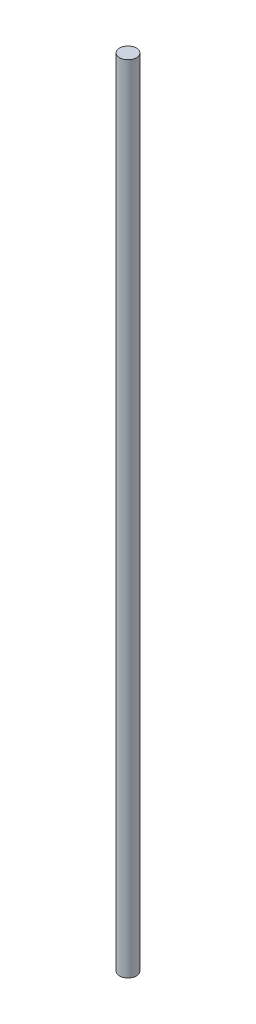
ISO-10303-21;
HEADER;
FILE_DESCRIPTION(('STEP AP214'),'2;1');
FILE_NAME('part.step','',(''),(''),'','','');
FILE_SCHEMA(('AUTOMOTIVE_DESIGN { 1 0 10303 214 1 1 1 1 }'));
ENDSEC;
DATA;
#1=APPLICATION_CONTEXT('core data for automotive mechanical design processes');
#2=APPLICATION_PROTOCOL_DEFINITION('international standard','automotive_design',2000,#1);
#3=PRODUCT_CONTEXT('',#1,'mechanical');
#4=PRODUCT('Part','Part','',(#3));
#5=PRODUCT_RELATED_PRODUCT_CATEGORY('part','',(#4));
#6=PRODUCT_DEFINITION_FORMATION('','',#4);
#7=PRODUCT_DEFINITION_CONTEXT('part definition',#1,'design');
#8=PRODUCT_DEFINITION('design','',#6,#7);
#9=PRODUCT_DEFINITION_SHAPE('','',#8);
#10=(LENGTH_UNIT() NAMED_UNIT(*) SI_UNIT(.MILLI.,.METRE.));
#11=(NAMED_UNIT(*) PLANE_ANGLE_UNIT() SI_UNIT($,.RADIAN.));
#12=(NAMED_UNIT(*) SI_UNIT($,.STERADIAN.) SOLID_ANGLE_UNIT());
#13=UNCERTAINTY_MEASURE_WITH_UNIT(LENGTH_MEASURE(1.E-05),#10,'distance_accuracy_value','');
#14=(GEOMETRIC_REPRESENTATION_CONTEXT(3) GLOBAL_UNCERTAINTY_ASSIGNED_CONTEXT((#13)) GLOBAL_UNIT_ASSIGNED_CONTEXT((#10,
#11,#12)) REPRESENTATION_CONTEXT('',''));
#15=CARTESIAN_POINT('',(0.,0.,0.));
#16=DIRECTION('',(0.,0.,1.));
#17=DIRECTION('',(1.,0.,0.));
#18=AXIS2_PLACEMENT_3D('',#15,#16,#17);
#19=CARTESIAN_POINT('',(0.,300.,0.));
#20=DIRECTION('',(0.,-1.,0.));
#21=DIRECTION('',(0.,0.,-1.));
#22=AXIS2_PLACEMENT_3D('',#19,#20,#21);
#23=CYLINDRICAL_SURFACE('',#22,3.175);
#24=CARTESIAN_POINT('',(0.,300.,0.));
#25=DIRECTION('',(0.,1.,0.));
#26=DIRECTION('',(0.,0.,1.));
#27=AXIS2_PLACEMENT_3D('',#24,#25,#26);
#28=CIRCLE('',#27,3.175);
#29=CARTESIAN_POINT('',(0.,300.,3.175));
#30=VERTEX_POINT('',#29);
#31=EDGE_CURVE('E10',#30,#30,#28,.T.);
#32=ORIENTED_EDGE('',*,*,#31,.F.);
#33=EDGE_LOOP('',(#32));
#34=FACE_BOUND('',#33,.T.);
#35=CARTESIAN_POINT('',(0.,0.,0.));
#36=DIRECTION('',(0.,1.,0.));
#37=DIRECTION('',(0.,0.,1.));
#38=AXIS2_PLACEMENT_3D('',#35,#36,#37);
#39=CIRCLE('',#38,3.175);
#40=CARTESIAN_POINT('',(0.,0.,3.175));
#41=VERTEX_POINT('',#40);
#42=EDGE_CURVE('E37',#41,#41,#39,.T.);
#43=ORIENTED_EDGE('',*,*,#42,.T.);
#44=EDGE_LOOP('',(#43));
#45=FACE_BOUND('',#44,.T.);
#46=ADVANCED_FACE('F34',(#34,#45),#23,.T.);
#47=CARTESIAN_POINT('',(0.,300.,0.));
#48=DIRECTION('',(0.,1.,0.));
#49=DIRECTION('',(0.,0.,1.));
#50=AXIS2_PLACEMENT_3D('',#47,#48,#49);
#51=PLANE('',#50);
#52=ORIENTED_EDGE('',*,*,#31,.T.);
#53=EDGE_LOOP('',(#52));
#54=FACE_BOUND('',#53,.T.);
#55=ADVANCED_FACE('F51',(#54),#51,.T.);
#56=CARTESIAN_POINT('',(0.,0.,0.));
#57=DIRECTION('',(0.,1.,0.));
#58=DIRECTION('',(0.,0.,1.));
#59=AXIS2_PLACEMENT_3D('',#56,#57,#58);
#60=PLANE('',#59);
#61=ORIENTED_EDGE('',*,*,#42,.F.);
#62=EDGE_LOOP('',(#61));
#63=FACE_BOUND('',#62,.T.);
#64=ADVANCED_FACE('F49',(#63),#60,.F.);
#65=CLOSED_SHELL('',(#46,#55,#64));
#66=MANIFOLD_SOLID_BREP('B2',#65);
#67=ADVANCED_BREP_SHAPE_REPRESENTATION('',(#18,#66),#14);
#68=SHAPE_DEFINITION_REPRESENTATION(#9,#67);
ENDSEC;
END-ISO-10303-21;
